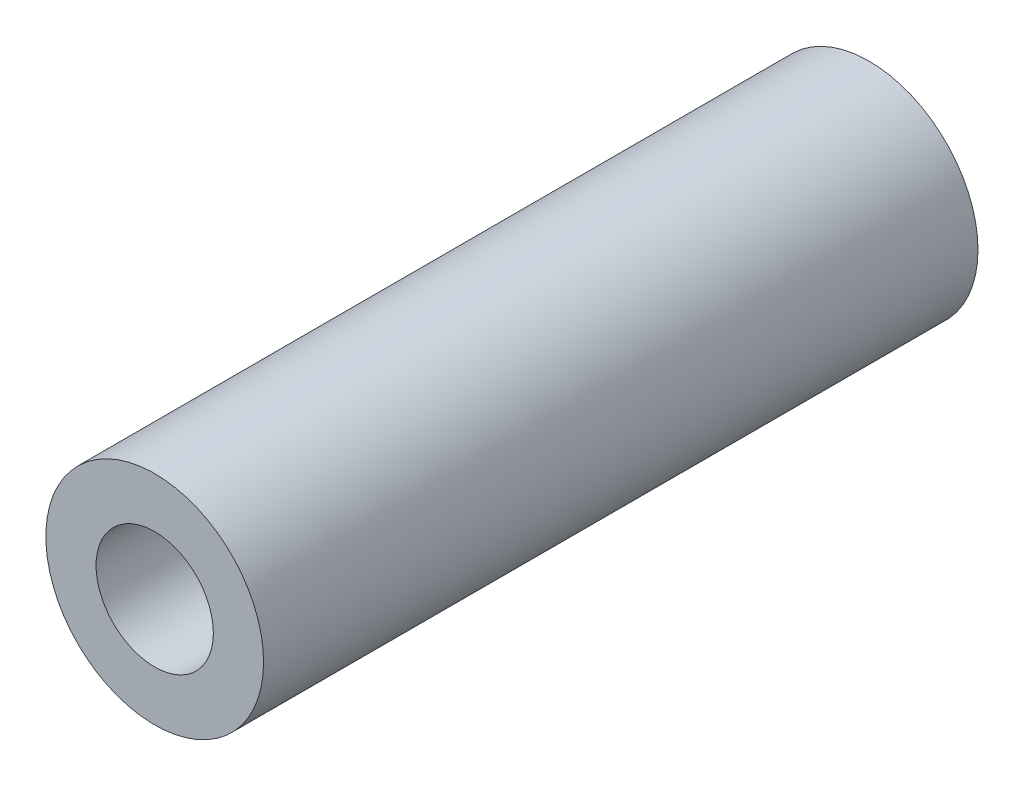
ISO-10303-21;
HEADER;
FILE_DESCRIPTION(('STEP AP214'),'2;1');
FILE_NAME('part.step','',(''),(''),'','','');
FILE_SCHEMA(('AUTOMOTIVE_DESIGN { 1 0 10303 214 1 1 1 1 }'));
ENDSEC;
DATA;
#1=APPLICATION_CONTEXT('core data for automotive mechanical design processes');
#2=APPLICATION_PROTOCOL_DEFINITION('international standard','automotive_design',2000,#1);
#3=PRODUCT_CONTEXT('',#1,'mechanical');
#4=PRODUCT('Part','Part','',(#3));
#5=PRODUCT_RELATED_PRODUCT_CATEGORY('part','',(#4));
#6=PRODUCT_DEFINITION_FORMATION('','',#4);
#7=PRODUCT_DEFINITION_CONTEXT('part definition',#1,'design');
#8=PRODUCT_DEFINITION('design','',#6,#7);
#9=PRODUCT_DEFINITION_SHAPE('','',#8);
#10=(LENGTH_UNIT() NAMED_UNIT(*) SI_UNIT(.MILLI.,.METRE.));
#11=(NAMED_UNIT(*) PLANE_ANGLE_UNIT() SI_UNIT($,.RADIAN.));
#12=(NAMED_UNIT(*) SI_UNIT($,.STERADIAN.) SOLID_ANGLE_UNIT());
#13=UNCERTAINTY_MEASURE_WITH_UNIT(LENGTH_MEASURE(1.E-05),#10,'distance_accuracy_value','');
#14=(GEOMETRIC_REPRESENTATION_CONTEXT(3) GLOBAL_UNCERTAINTY_ASSIGNED_CONTEXT((#13)) GLOBAL_UNIT_ASSIGNED_CONTEXT((#10,
#11,#12)) REPRESENTATION_CONTEXT('',''));
#15=CARTESIAN_POINT('',(0.,0.,0.));
#16=DIRECTION('',(0.,0.,1.));
#17=DIRECTION('',(1.,0.,0.));
#18=AXIS2_PLACEMENT_3D('',#15,#16,#17);
#19=CARTESIAN_POINT('',(0.,0.,31.2547));
#20=DIRECTION('',(0.,0.,1.));
#21=DIRECTION('',(1.,0.,0.));
#22=AXIS2_PLACEMENT_3D('',#19,#20,#21);
#23=PLANE('',#22);
#24=CARTESIAN_POINT('',(0.,0.,31.2547));
#25=DIRECTION('',(0.,0.,1.));
#26=DIRECTION('',(1.,0.,0.));
#27=AXIS2_PLACEMENT_3D('',#24,#25,#26);
#28=CIRCLE('',#27,4.7625);
#29=CARTESIAN_POINT('',(4.7625,0.,31.2547));
#30=VERTEX_POINT('',#29);
#31=EDGE_CURVE('E10',#30,#30,#28,.T.);
#32=ORIENTED_EDGE('',*,*,#31,.T.);
#33=EDGE_LOOP('',(#32));
#34=FACE_BOUND('',#33,.T.);
#35=CARTESIAN_POINT('',(0.,0.,31.2547));
#36=DIRECTION('',(0.,0.,1.));
#37=DIRECTION('',(1.,0.,0.));
#38=AXIS2_PLACEMENT_3D('',#35,#36,#37);
#39=CIRCLE('',#38,2.5654);
#40=CARTESIAN_POINT('',(2.5654,0.,31.2547));
#41=VERTEX_POINT('',#40);
#42=EDGE_CURVE('E42',#41,#41,#39,.T.);
#43=ORIENTED_EDGE('',*,*,#42,.F.);
#44=EDGE_LOOP('',(#43));
#45=FACE_BOUND('',#44,.T.);
#46=ADVANCED_FACE('F31',(#34,#45),#23,.T.);
#47=CARTESIAN_POINT('',(0.,0.,0.));
#48=DIRECTION('',(0.,0.,1.));
#49=DIRECTION('',(1.,0.,0.));
#50=AXIS2_PLACEMENT_3D('',#47,#48,#49);
#51=PLANE('',#50);
#52=CARTESIAN_POINT('',(0.,0.,0.));
#53=DIRECTION('',(0.,0.,1.));
#54=DIRECTION('',(1.,0.,0.));
#55=AXIS2_PLACEMENT_3D('',#52,#53,#54);
#56=CIRCLE('',#55,4.7625);
#57=CARTESIAN_POINT('',(4.7625,0.,0.));
#58=VERTEX_POINT('',#57);
#59=EDGE_CURVE('E35',#58,#58,#56,.T.);
#60=ORIENTED_EDGE('',*,*,#59,.F.);
#61=EDGE_LOOP('',(#60));
#62=FACE_BOUND('',#61,.T.);
#63=CARTESIAN_POINT('',(0.,0.,0.));
#64=DIRECTION('',(0.,0.,1.));
#65=DIRECTION('',(1.,0.,0.));
#66=AXIS2_PLACEMENT_3D('',#63,#64,#65);
#67=CIRCLE('',#66,2.5654);
#68=CARTESIAN_POINT('',(2.5654,0.,0.));
#69=VERTEX_POINT('',#68);
#70=EDGE_CURVE('E44',#69,#69,#67,.T.);
#71=ORIENTED_EDGE('',*,*,#70,.T.);
#72=EDGE_LOOP('',(#71));
#73=FACE_BOUND('',#72,.T.);
#74=ADVANCED_FACE('F54',(#62,#73),#51,.F.);
#75=CARTESIAN_POINT('',(0.,0.,31.2547));
#76=DIRECTION('',(0.,0.,-1.));
#77=DIRECTION('',(-1.,0.,0.));
#78=AXIS2_PLACEMENT_3D('',#75,#76,#77);
#79=CYLINDRICAL_SURFACE('',#78,4.7625);
#80=ORIENTED_EDGE('',*,*,#31,.F.);
#81=EDGE_LOOP('',(#80));
#82=FACE_BOUND('',#81,.T.);
#83=ORIENTED_EDGE('',*,*,#59,.T.);
#84=EDGE_LOOP('',(#83));
#85=FACE_BOUND('',#84,.T.);
#86=ADVANCED_FACE('F33',(#82,#85),#79,.T.);
#87=CARTESIAN_POINT('',(0.,0.,31.2547));
#88=DIRECTION('',(0.,0.,-1.));
#89=DIRECTION('',(-1.,0.,0.));
#90=AXIS2_PLACEMENT_3D('',#87,#88,#89);
#91=CYLINDRICAL_SURFACE('',#90,2.5654);
#92=ORIENTED_EDGE('',*,*,#42,.T.);
#93=EDGE_LOOP('',(#92));
#94=FACE_BOUND('',#93,.T.);
#95=ORIENTED_EDGE('',*,*,#70,.F.);
#96=EDGE_LOOP('',(#95));
#97=FACE_BOUND('',#96,.T.);
#98=ADVANCED_FACE('F50',(#94,#97),#91,.F.);
#99=CLOSED_SHELL('',(#46,#74,#86,#98));
#100=MANIFOLD_SOLID_BREP('B2',#99);
#101=ADVANCED_BREP_SHAPE_REPRESENTATION('',(#18,#100),#14);
#102=SHAPE_DEFINITION_REPRESENTATION(#9,#101);
ENDSEC;
END-ISO-10303-21;
